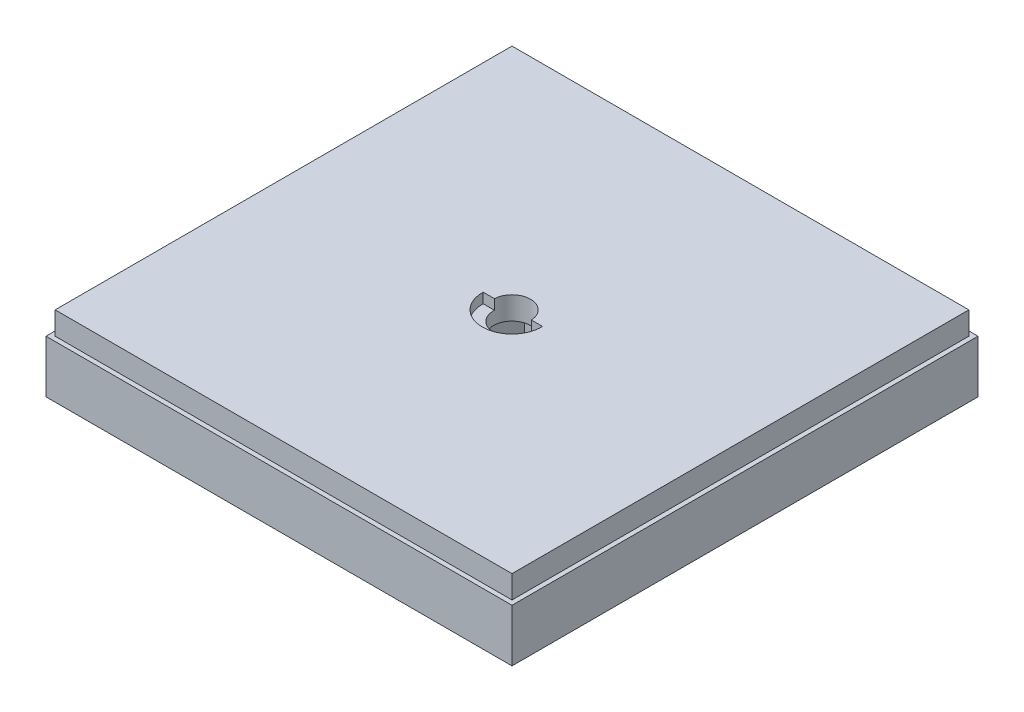
ISO-10303-21;
HEADER;
FILE_DESCRIPTION(('STEP AP214'),'2;1');
FILE_NAME('part.step','',(''),(''),'','','');
FILE_SCHEMA(('AUTOMOTIVE_DESIGN { 1 0 10303 214 1 1 1 1 }'));
ENDSEC;
DATA;
#1=APPLICATION_CONTEXT('core data for automotive mechanical design processes');
#2=APPLICATION_PROTOCOL_DEFINITION('international standard','automotive_design',2000,#1);
#3=PRODUCT_CONTEXT('',#1,'mechanical');
#4=PRODUCT('Part','Part','',(#3));
#5=PRODUCT_RELATED_PRODUCT_CATEGORY('part','',(#4));
#6=PRODUCT_DEFINITION_FORMATION('','',#4);
#7=PRODUCT_DEFINITION_CONTEXT('part definition',#1,'design');
#8=PRODUCT_DEFINITION('design','',#6,#7);
#9=PRODUCT_DEFINITION_SHAPE('','',#8);
#10=(LENGTH_UNIT() NAMED_UNIT(*) SI_UNIT(.MILLI.,.METRE.));
#11=(NAMED_UNIT(*) PLANE_ANGLE_UNIT() SI_UNIT($,.RADIAN.));
#12=(NAMED_UNIT(*) SI_UNIT($,.STERADIAN.) SOLID_ANGLE_UNIT());
#13=UNCERTAINTY_MEASURE_WITH_UNIT(LENGTH_MEASURE(1.E-05),#10,'distance_accuracy_value','');
#14=(GEOMETRIC_REPRESENTATION_CONTEXT(3) GLOBAL_UNCERTAINTY_ASSIGNED_CONTEXT((#13)) GLOBAL_UNIT_ASSIGNED_CONTEXT((#10,
#11,#12)) REPRESENTATION_CONTEXT('',''));
#15=CARTESIAN_POINT('',(0.,0.,0.));
#16=DIRECTION('',(0.,0.,1.));
#17=DIRECTION('',(1.,0.,0.));
#18=AXIS2_PLACEMENT_3D('',#15,#16,#17);
#19=CARTESIAN_POINT('',(-47.2472232502674,11.5,-44.5));
#20=DIRECTION('',(-0.866025403784439,0.,-0.5));
#21=DIRECTION('',(-0.5,0.,0.866025403784439));
#22=AXIS2_PLACEMENT_3D('',#19,#20,#21);
#23=PLANE('',#22);
#24=DIRECTION('',(0.,-1.,0.));
#25=VECTOR('',#24,1.);
#26=CARTESIAN_POINT('',(-43.4944465005349,11.5,-51.));
#27=LINE('',#26,#25);
#28=CARTESIAN_POINT('',(-43.4944465005349,11.5,-51.));
#29=VERTEX_POINT('',#28);
#30=CARTESIAN_POINT('',(-43.4944465005349,7.,-51.));
#31=VERTEX_POINT('',#30);
#32=EDGE_CURVE('E320',#29,#31,#27,.T.);
#33=ORIENTED_EDGE('',*,*,#32,.T.);
#34=DIRECTION('',(-0.5,0.,0.866025403784439));
#35=VECTOR('',#34,1.);
#36=CARTESIAN_POINT('',(-47.2472232502674,7.,-44.5));
#37=LINE('',#36,#35);
#38=CARTESIAN_POINT('',(-47.2472232502674,7.,-44.5));
#39=VERTEX_POINT('',#38);
#40=EDGE_CURVE('E219',#31,#39,#37,.T.);
#41=ORIENTED_EDGE('',*,*,#40,.T.);
#42=DIRECTION('',(0.,-1.,0.));
#43=VECTOR('',#42,1.);
#44=CARTESIAN_POINT('',(-47.2472232502674,11.5,-44.5));
#45=LINE('',#44,#43);
#46=CARTESIAN_POINT('',(-47.2472232502674,11.5,-44.5));
#47=VERTEX_POINT('',#46);
#48=EDGE_CURVE('E300',#47,#39,#45,.T.);
#49=ORIENTED_EDGE('',*,*,#48,.F.);
#50=DIRECTION('',(0.5,0.,-0.866025403784439));
#51=VECTOR('',#50,1.);
#52=CARTESIAN_POINT('',(-47.2472232502674,11.5,-44.5));
#53=LINE('',#52,#51);
#54=EDGE_CURVE('E276',#47,#29,#53,.T.);
#55=ORIENTED_EDGE('',*,*,#54,.T.);
#56=EDGE_LOOP('',(#33,#41,#49,#55));
#57=FACE_BOUND('',#56,.T.);
#58=ADVANCED_FACE('F39',(#57),#23,.T.);
#59=CARTESIAN_POINT('',(-43.4944465005349,11.5,-51.));
#60=DIRECTION('',(-0.866025403784439,0.,0.5));
#61=DIRECTION('',(0.5,0.,0.866025403784439));
#62=AXIS2_PLACEMENT_3D('',#59,#60,#61);
#63=PLANE('',#62);
#64=DIRECTION('',(0.,-1.,0.));
#65=VECTOR('',#64,1.);
#66=CARTESIAN_POINT('',(-47.2472232502674,11.5,-57.5));
#67=LINE('',#66,#65);
#68=CARTESIAN_POINT('',(-47.2472232502674,11.5,-57.5));
#69=VERTEX_POINT('',#68);
#70=CARTESIAN_POINT('',(-47.2472232502674,7.,-57.5));
#71=VERTEX_POINT('',#70);
#72=EDGE_CURVE('E316',#69,#71,#67,.T.);
#73=ORIENTED_EDGE('',*,*,#72,.T.);
#74=DIRECTION('',(0.5,0.,0.866025403784439));
#75=VECTOR('',#74,1.);
#76=CARTESIAN_POINT('',(-43.4944465005349,7.,-51.));
#77=LINE('',#76,#75);
#78=EDGE_CURVE('E215',#71,#31,#77,.T.);
#79=ORIENTED_EDGE('',*,*,#78,.T.);
#80=ORIENTED_EDGE('',*,*,#32,.F.);
#81=DIRECTION('',(-0.5,0.,-0.866025403784439));
#82=VECTOR('',#81,1.);
#83=CARTESIAN_POINT('',(-43.4944465005349,11.5,-51.));
#84=LINE('',#83,#82);
#85=EDGE_CURVE('E280',#29,#69,#84,.T.);
#86=ORIENTED_EDGE('',*,*,#85,.T.);
#87=EDGE_LOOP('',(#73,#79,#80,#86));
#88=FACE_BOUND('',#87,.T.);
#89=ADVANCED_FACE('F406',(#88),#63,.T.);
#90=CARTESIAN_POINT('',(-47.2472232502674,11.5,-57.5));
#91=DIRECTION('',(0.,0.,1.));
#92=DIRECTION('',(1.,0.,0.));
#93=AXIS2_PLACEMENT_3D('',#90,#91,#92);
#94=PLANE('',#93);
#95=DIRECTION('',(0.,-1.,0.));
#96=VECTOR('',#95,1.);
#97=CARTESIAN_POINT('',(-54.7527767497326,11.5,-57.5));
#98=LINE('',#97,#96);
#99=CARTESIAN_POINT('',(-54.7527767497326,11.5,-57.5));
#100=VERTEX_POINT('',#99);
#101=CARTESIAN_POINT('',(-54.7527767497326,7.,-57.5));
#102=VERTEX_POINT('',#101);
#103=EDGE_CURVE('E312',#100,#102,#98,.T.);
#104=ORIENTED_EDGE('',*,*,#103,.T.);
#105=DIRECTION('',(1.,0.,0.));
#106=VECTOR('',#105,1.);
#107=CARTESIAN_POINT('',(-47.2472232502674,7.,-57.5));
#108=LINE('',#107,#106);
#109=EDGE_CURVE('E211',#102,#71,#108,.T.);
#110=ORIENTED_EDGE('',*,*,#109,.T.);
#111=ORIENTED_EDGE('',*,*,#72,.F.);
#112=DIRECTION('',(-1.,0.,0.));
#113=VECTOR('',#112,1.);
#114=CARTESIAN_POINT('',(-47.2472232502674,11.5,-57.5));
#115=LINE('',#114,#113);
#116=EDGE_CURVE('E284',#69,#100,#115,.T.);
#117=ORIENTED_EDGE('',*,*,#116,.T.);
#118=EDGE_LOOP('',(#104,#110,#111,#117));
#119=FACE_BOUND('',#118,.T.);
#120=ADVANCED_FACE('F412',(#119),#94,.T.);
#121=CARTESIAN_POINT('',(-54.7527767497326,11.5,-57.5));
#122=DIRECTION('',(0.866025403784438,0.,0.5));
#123=DIRECTION('',(0.500000000000001,0.,-0.866025403784438));
#124=AXIS2_PLACEMENT_3D('',#121,#122,#123);
#125=PLANE('',#124);
#126=DIRECTION('',(0.,-1.,0.));
#127=VECTOR('',#126,1.);
#128=CARTESIAN_POINT('',(-58.5055534994651,11.5,-51.));
#129=LINE('',#128,#127);
#130=CARTESIAN_POINT('',(-58.5055534994651,11.5,-51.));
#131=VERTEX_POINT('',#130);
#132=CARTESIAN_POINT('',(-58.5055534994651,7.,-51.));
#133=VERTEX_POINT('',#132);
#134=EDGE_CURVE('E308',#131,#133,#129,.T.);
#135=ORIENTED_EDGE('',*,*,#134,.T.);
#136=DIRECTION('',(0.500000000000001,0.,-0.866025403784438));
#137=VECTOR('',#136,1.);
#138=CARTESIAN_POINT('',(-54.7527767497326,7.,-57.5));
#139=LINE('',#138,#137);
#140=EDGE_CURVE('E207',#133,#102,#139,.T.);
#141=ORIENTED_EDGE('',*,*,#140,.T.);
#142=ORIENTED_EDGE('',*,*,#103,.F.);
#143=DIRECTION('',(-0.5,0.,0.866025403784438));
#144=VECTOR('',#143,1.);
#145=CARTESIAN_POINT('',(-54.7527767497326,11.5,-57.5));
#146=LINE('',#145,#144);
#147=EDGE_CURVE('E288',#100,#131,#146,.T.);
#148=ORIENTED_EDGE('',*,*,#147,.T.);
#149=EDGE_LOOP('',(#135,#141,#142,#148));
#150=FACE_BOUND('',#149,.T.);
#151=ADVANCED_FACE('F477',(#150),#125,.T.);
#152=CARTESIAN_POINT('',(-58.5055534994651,11.5,-51.));
#153=DIRECTION('',(0.866025403784439,0.,-0.5));
#154=DIRECTION('',(-0.5,0.,-0.866025403784439));
#155=AXIS2_PLACEMENT_3D('',#152,#153,#154);
#156=PLANE('',#155);
#157=DIRECTION('',(0.,-1.,0.));
#158=VECTOR('',#157,1.);
#159=CARTESIAN_POINT('',(-54.7527767497326,11.5,-44.5));
#160=LINE('',#159,#158);
#161=CARTESIAN_POINT('',(-54.7527767497326,11.5,-44.5));
#162=VERTEX_POINT('',#161);
#163=CARTESIAN_POINT('',(-54.7527767497326,7.,-44.5));
#164=VERTEX_POINT('',#163);
#165=EDGE_CURVE('E304',#162,#164,#160,.T.);
#166=ORIENTED_EDGE('',*,*,#165,.T.);
#167=DIRECTION('',(-0.5,0.,-0.866025403784439));
#168=VECTOR('',#167,1.);
#169=CARTESIAN_POINT('',(-58.5055534994651,7.,-51.));
#170=LINE('',#169,#168);
#171=EDGE_CURVE('E62',#164,#133,#170,.T.);
#172=ORIENTED_EDGE('',*,*,#171,.T.);
#173=ORIENTED_EDGE('',*,*,#134,.F.);
#174=DIRECTION('',(0.5,0.,0.866025403784439));
#175=VECTOR('',#174,1.);
#176=CARTESIAN_POINT('',(-58.5055534994651,11.5,-51.));
#177=LINE('',#176,#175);
#178=EDGE_CURVE('E292',#131,#162,#177,.T.);
#179=ORIENTED_EDGE('',*,*,#178,.T.);
#180=EDGE_LOOP('',(#166,#172,#173,#179));
#181=FACE_BOUND('',#180,.T.);
#182=ADVANCED_FACE('F469',(#181),#156,.T.);
#183=CARTESIAN_POINT('',(-54.7527767497326,11.5,-44.5));
#184=DIRECTION('',(0.,0.,-1.));
#185=DIRECTION('',(-1.,0.,0.));
#186=AXIS2_PLACEMENT_3D('',#183,#184,#185);
#187=PLANE('',#186);
#188=ORIENTED_EDGE('',*,*,#48,.T.);
#189=DIRECTION('',(-1.,0.,0.));
#190=VECTOR('',#189,1.);
#191=CARTESIAN_POINT('',(-54.7527767497326,7.,-44.5));
#192=LINE('',#191,#190);
#193=EDGE_CURVE('E366',#39,#164,#192,.T.);
#194=ORIENTED_EDGE('',*,*,#193,.T.);
#195=ORIENTED_EDGE('',*,*,#165,.F.);
#196=DIRECTION('',(1.,0.,0.));
#197=VECTOR('',#196,1.);
#198=CARTESIAN_POINT('',(-54.7527767497326,11.5,-44.5));
#199=LINE('',#198,#197);
#200=EDGE_CURVE('E296',#162,#47,#199,.T.);
#201=ORIENTED_EDGE('',*,*,#200,.T.);
#202=EDGE_LOOP('',(#188,#194,#195,#201));
#203=FACE_BOUND('',#202,.T.);
#204=ADVANCED_FACE('F421',(#203),#187,.T.);
#205=CARTESIAN_POINT('',(0.,11.5,0.));
#206=DIRECTION('',(0.,1.,0.));
#207=DIRECTION('',(0.,0.,1.));
#208=AXIS2_PLACEMENT_3D('',#205,#206,#207);
#209=PLANE('',#208);
#210=DIRECTION('',(-1.,0.,0.));
#211=VECTOR('',#210,1.);
#212=CARTESIAN_POINT('',(-1.,11.5,-101.));
#213=LINE('',#212,#211);
#214=CARTESIAN_POINT('',(-1.,11.5,-101.));
#215=VERTEX_POINT('',#214);
#216=CARTESIAN_POINT('',(-101.,11.5,-101.));
#217=VERTEX_POINT('',#216);
#218=EDGE_CURVE('E228',#215,#217,#213,.T.);
#219=ORIENTED_EDGE('',*,*,#218,.F.);
#220=DIRECTION('',(0.,0.,-1.));
#221=VECTOR('',#220,1.);
#222=CARTESIAN_POINT('',(-1.,11.5,-1.));
#223=LINE('',#222,#221);
#224=CARTESIAN_POINT('',(-1.,11.5,-1.));
#225=VERTEX_POINT('',#224);
#226=EDGE_CURVE('E237',#225,#215,#223,.T.);
#227=ORIENTED_EDGE('',*,*,#226,.F.);
#228=DIRECTION('',(1.,0.,0.));
#229=VECTOR('',#228,1.);
#230=CARTESIAN_POINT('',(-101.,11.5,-1.));
#231=LINE('',#230,#229);
#232=CARTESIAN_POINT('',(-101.,11.5,-1.));
#233=VERTEX_POINT('',#232);
#234=EDGE_CURVE('E254',#233,#225,#231,.T.);
#235=ORIENTED_EDGE('',*,*,#234,.F.);
#236=DIRECTION('',(0.,0.,1.));
#237=VECTOR('',#236,1.);
#238=CARTESIAN_POINT('',(-101.,11.5,-101.));
#239=LINE('',#238,#237);
#240=EDGE_CURVE('E250',#217,#233,#239,.T.);
#241=ORIENTED_EDGE('',*,*,#240,.F.);
#242=EDGE_LOOP('',(#219,#227,#235,#241));
#243=FACE_BOUND('',#242,.T.);
#244=DIRECTION('',(0.,0.,1.));
#245=VECTOR('',#244,1.);
#246=CARTESIAN_POINT('',(-102.,11.5,-102.));
#247=LINE('',#246,#245);
#248=CARTESIAN_POINT('',(-102.,11.5,-102.));
#249=VERTEX_POINT('',#248);
#250=CARTESIAN_POINT('',(-102.,11.5,0.));
#251=VERTEX_POINT('',#250);
#252=EDGE_CURVE('E325',#249,#251,#247,.T.);
#253=ORIENTED_EDGE('',*,*,#252,.T.);
#254=DIRECTION('',(1.,0.,0.));
#255=VECTOR('',#254,1.);
#256=CARTESIAN_POINT('',(-102.,11.5,0.));
#257=LINE('',#256,#255);
#258=CARTESIAN_POINT('',(0.,11.5,0.));
#259=VERTEX_POINT('',#258);
#260=EDGE_CURVE('E329',#251,#259,#257,.T.);
#261=ORIENTED_EDGE('',*,*,#260,.T.);
#262=DIRECTION('',(0.,0.,-1.));
#263=VECTOR('',#262,1.);
#264=CARTESIAN_POINT('',(0.,11.5,-102.));
#265=LINE('',#264,#263);
#266=CARTESIAN_POINT('',(0.,11.5,-102.));
#267=VERTEX_POINT('',#266);
#268=EDGE_CURVE('E333',#259,#267,#265,.T.);
#269=ORIENTED_EDGE('',*,*,#268,.T.);
#270=DIRECTION('',(-1.,0.,0.));
#271=VECTOR('',#270,1.);
#272=CARTESIAN_POINT('',(-102.,11.5,-102.));
#273=LINE('',#272,#271);
#274=EDGE_CURVE('E336',#267,#249,#273,.T.);
#275=ORIENTED_EDGE('',*,*,#274,.T.);
#276=EDGE_LOOP('',(#253,#261,#269,#275));
#277=FACE_BOUND('',#276,.T.);
#278=ADVANCED_FACE('F417',(#243,#277),#209,.T.);
#279=CARTESIAN_POINT('',(0.,0.,0.));
#280=DIRECTION('',(0.,1.,0.));
#281=DIRECTION('',(0.,0.,1.));
#282=AXIS2_PLACEMENT_3D('',#279,#280,#281);
#283=PLANE('',#282);
#284=CARTESIAN_POINT('',(-51.,0.,-51.));
#285=DIRECTION('',(0.,-1.,0.));
#286=DIRECTION('',(0.,0.,-1.));
#287=AXIS2_PLACEMENT_3D('',#284,#285,#286);
#288=CIRCLE('',#287,8.);
#289=CARTESIAN_POINT('',(-51.,0.,-59.));
#290=VERTEX_POINT('',#289);
#291=EDGE_CURVE('E196',#290,#290,#288,.T.);
#292=ORIENTED_EDGE('',*,*,#291,.F.);
#293=EDGE_LOOP('',(#292));
#294=FACE_BOUND('',#293,.T.);
#295=DIRECTION('',(0.,0.,1.));
#296=VECTOR('',#295,1.);
#297=CARTESIAN_POINT('',(-102.,0.,-102.));
#298=LINE('',#297,#296);
#299=CARTESIAN_POINT('',(-102.,0.,-102.));
#300=VERTEX_POINT('',#299);
#301=CARTESIAN_POINT('',(-102.,0.,0.));
#302=VERTEX_POINT('',#301);
#303=EDGE_CURVE('E324',#300,#302,#298,.T.);
#304=ORIENTED_EDGE('',*,*,#303,.F.);
#305=DIRECTION('',(-1.,0.,0.));
#306=VECTOR('',#305,1.);
#307=CARTESIAN_POINT('',(-102.,0.,-102.));
#308=LINE('',#307,#306);
#309=CARTESIAN_POINT('',(0.,0.,-102.));
#310=VERTEX_POINT('',#309);
#311=EDGE_CURVE('E330',#310,#300,#308,.T.);
#312=ORIENTED_EDGE('',*,*,#311,.F.);
#313=DIRECTION('',(0.,0.,-1.));
#314=VECTOR('',#313,1.);
#315=CARTESIAN_POINT('',(0.,0.,-102.));
#316=LINE('',#315,#314);
#317=CARTESIAN_POINT('',(0.,0.,0.));
#318=VERTEX_POINT('',#317);
#319=EDGE_CURVE('E346',#318,#310,#316,.T.);
#320=ORIENTED_EDGE('',*,*,#319,.F.);
#321=DIRECTION('',(1.,0.,0.));
#322=VECTOR('',#321,1.);
#323=CARTESIAN_POINT('',(-102.,0.,0.));
#324=LINE('',#323,#322);
#325=EDGE_CURVE('E343',#302,#318,#324,.T.);
#326=ORIENTED_EDGE('',*,*,#325,.F.);
#327=EDGE_LOOP('',(#304,#312,#320,#326));
#328=FACE_BOUND('',#327,.T.);
#329=ADVANCED_FACE('F420',(#294,#328),#283,.F.);
#330=CARTESIAN_POINT('',(-102.,11.5,-102.));
#331=DIRECTION('',(1.,0.,0.));
#332=DIRECTION('',(0.,0.,-1.));
#333=AXIS2_PLACEMENT_3D('',#330,#331,#332);
#334=PLANE('',#333);
#335=ORIENTED_EDGE('',*,*,#303,.T.);
#336=DIRECTION('',(0.,-1.,0.));
#337=VECTOR('',#336,1.);
#338=CARTESIAN_POINT('',(-102.,11.5,0.));
#339=LINE('',#338,#337);
#340=EDGE_CURVE('E362',#251,#302,#339,.T.);
#341=ORIENTED_EDGE('',*,*,#340,.F.);
#342=ORIENTED_EDGE('',*,*,#252,.F.);
#343=DIRECTION('',(0.,-1.,0.));
#344=VECTOR('',#343,1.);
#345=CARTESIAN_POINT('',(-102.,11.5,-102.));
#346=LINE('',#345,#344);
#347=EDGE_CURVE('E339',#249,#300,#346,.T.);
#348=ORIENTED_EDGE('',*,*,#347,.T.);
#349=EDGE_LOOP('',(#335,#341,#342,#348));
#350=FACE_BOUND('',#349,.T.);
#351=ADVANCED_FACE('F41',(#350),#334,.F.);
#352=CARTESIAN_POINT('',(-102.,11.5,0.));
#353=DIRECTION('',(0.,0.,-1.));
#354=DIRECTION('',(-1.,0.,0.));
#355=AXIS2_PLACEMENT_3D('',#352,#353,#354);
#356=PLANE('',#355);
#357=ORIENTED_EDGE('',*,*,#325,.T.);
#358=DIRECTION('',(0.,-1.,0.));
#359=VECTOR('',#358,1.);
#360=CARTESIAN_POINT('',(0.,11.5,0.));
#361=LINE('',#360,#359);
#362=EDGE_CURVE('E358',#259,#318,#361,.T.);
#363=ORIENTED_EDGE('',*,*,#362,.F.);
#364=ORIENTED_EDGE('',*,*,#260,.F.);
#365=ORIENTED_EDGE('',*,*,#340,.T.);
#366=EDGE_LOOP('',(#357,#363,#364,#365));
#367=FACE_BOUND('',#366,.T.);
#368=ADVANCED_FACE('F431',(#367),#356,.F.);
#369=CARTESIAN_POINT('',(0.,11.5,-102.));
#370=DIRECTION('',(-1.,0.,0.));
#371=DIRECTION('',(0.,0.,1.));
#372=AXIS2_PLACEMENT_3D('',#369,#370,#371);
#373=PLANE('',#372);
#374=ORIENTED_EDGE('',*,*,#319,.T.);
#375=DIRECTION('',(0.,-1.,0.));
#376=VECTOR('',#375,1.);
#377=CARTESIAN_POINT('',(0.,11.5,-102.));
#378=LINE('',#377,#376);
#379=EDGE_CURVE('E354',#267,#310,#378,.T.);
#380=ORIENTED_EDGE('',*,*,#379,.F.);
#381=ORIENTED_EDGE('',*,*,#268,.F.);
#382=ORIENTED_EDGE('',*,*,#362,.T.);
#383=EDGE_LOOP('',(#374,#380,#381,#382));
#384=FACE_BOUND('',#383,.T.);
#385=ADVANCED_FACE('F428',(#384),#373,.F.);
#386=CARTESIAN_POINT('',(-102.,11.5,-102.));
#387=DIRECTION('',(0.,0.,1.));
#388=DIRECTION('',(1.,0.,0.));
#389=AXIS2_PLACEMENT_3D('',#386,#387,#388);
#390=PLANE('',#389);
#391=ORIENTED_EDGE('',*,*,#311,.T.);
#392=ORIENTED_EDGE('',*,*,#347,.F.);
#393=ORIENTED_EDGE('',*,*,#274,.F.);
#394=ORIENTED_EDGE('',*,*,#379,.T.);
#395=EDGE_LOOP('',(#391,#392,#393,#394));
#396=FACE_BOUND('',#395,.T.);
#397=ADVANCED_FACE('F402',(#396),#390,.F.);
#398=CARTESIAN_POINT('',(0.,16.5,0.));
#399=DIRECTION('',(0.,1.,0.));
#400=DIRECTION('',(0.,0.,1.));
#401=AXIS2_PLACEMENT_3D('',#398,#399,#400);
#402=PLANE('',#401);
#403=DIRECTION('',(-1.,0.,0.));
#404=VECTOR('',#403,1.);
#405=CARTESIAN_POINT('',(-57.4969223483123,16.5,-51.2));
#406=LINE('',#405,#404);
#407=CARTESIAN_POINT('',(-44.5030776516877,16.5,-51.2));
#408=VERTEX_POINT('',#407);
#409=CARTESIAN_POINT('',(-46.9549412859638,16.5,-51.2));
#410=VERTEX_POINT('',#409);
#411=EDGE_CURVE('E181',#408,#410,#406,.T.);
#412=ORIENTED_EDGE('',*,*,#411,.F.);
#413=CARTESIAN_POINT('',(-51.,16.5,-51.));
#414=DIRECTION('',(0.,1.,0.));
#415=DIRECTION('',(0.,0.,1.));
#416=AXIS2_PLACEMENT_3D('',#413,#414,#415);
#417=CIRCLE('',#416,6.5);
#418=CARTESIAN_POINT('',(-57.4969223483123,16.5,-51.2));
#419=VERTEX_POINT('',#418);
#420=EDGE_CURVE('E170',#419,#408,#417,.T.);
#421=ORIENTED_EDGE('',*,*,#420,.F.);
#422=CARTESIAN_POINT('',(-55.0450587140362,16.5,-51.2));
#423=VERTEX_POINT('',#422);
#424=EDGE_CURVE('E192',#423,#419,#406,.T.);
#425=ORIENTED_EDGE('',*,*,#424,.F.);
#426=CARTESIAN_POINT('',(-51.,16.5,-51.));
#427=DIRECTION('',(0.,1.,0.));
#428=DIRECTION('',(0.,0.,1.));
#429=AXIS2_PLACEMENT_3D('',#426,#427,#428);
#430=CIRCLE('',#429,4.05);
#431=EDGE_CURVE('E224',#410,#423,#430,.T.);
#432=ORIENTED_EDGE('',*,*,#431,.F.);
#433=EDGE_LOOP('',(#412,#421,#425,#432));
#434=FACE_BOUND('',#433,.T.);
#435=DIRECTION('',(-1.,0.,0.));
#436=VECTOR('',#435,1.);
#437=CARTESIAN_POINT('',(-1.,16.5,-101.));
#438=LINE('',#437,#436);
#439=CARTESIAN_POINT('',(-1.,16.5,-101.));
#440=VERTEX_POINT('',#439);
#441=CARTESIAN_POINT('',(-101.,16.5,-101.));
#442=VERTEX_POINT('',#441);
#443=EDGE_CURVE('E232',#440,#442,#438,.T.);
#444=ORIENTED_EDGE('',*,*,#443,.T.);
#445=DIRECTION('',(0.,0.,1.));
#446=VECTOR('',#445,1.);
#447=CARTESIAN_POINT('',(-101.,16.5,-101.));
#448=LINE('',#447,#446);
#449=CARTESIAN_POINT('',(-101.,16.5,-1.));
#450=VERTEX_POINT('',#449);
#451=EDGE_CURVE('E236',#442,#450,#448,.T.);
#452=ORIENTED_EDGE('',*,*,#451,.T.);
#453=DIRECTION('',(1.,0.,0.));
#454=VECTOR('',#453,1.);
#455=CARTESIAN_POINT('',(-101.,16.5,-1.));
#456=LINE('',#455,#454);
#457=CARTESIAN_POINT('',(-1.,16.5,-1.));
#458=VERTEX_POINT('',#457);
#459=EDGE_CURVE('E240',#450,#458,#456,.T.);
#460=ORIENTED_EDGE('',*,*,#459,.T.);
#461=DIRECTION('',(0.,0.,-1.));
#462=VECTOR('',#461,1.);
#463=CARTESIAN_POINT('',(-1.,16.5,-1.));
#464=LINE('',#463,#462);
#465=EDGE_CURVE('E243',#458,#440,#464,.T.);
#466=ORIENTED_EDGE('',*,*,#465,.T.);
#467=EDGE_LOOP('',(#444,#452,#460,#466));
#468=FACE_BOUND('',#467,.T.);
#469=ADVANCED_FACE('F379',(#434,#468),#402,.T.);
#470=CARTESIAN_POINT('',(0.,11.5,0.));
#471=DIRECTION('',(0.,1.,0.));
#472=DIRECTION('',(0.,0.,1.));
#473=AXIS2_PLACEMENT_3D('',#470,#471,#472);
#474=PLANE('',#473);
#475=ORIENTED_EDGE('',*,*,#85,.F.);
#476=ORIENTED_EDGE('',*,*,#54,.F.);
#477=ORIENTED_EDGE('',*,*,#200,.F.);
#478=ORIENTED_EDGE('',*,*,#178,.F.);
#479=ORIENTED_EDGE('',*,*,#147,.F.);
#480=ORIENTED_EDGE('',*,*,#116,.F.);
#481=EDGE_LOOP('',(#475,#476,#477,#478,#479,#480));
#482=FACE_BOUND('',#481,.T.);
#483=CARTESIAN_POINT('',(-51.,11.5,-51.));
#484=DIRECTION('',(0.,1.,0.));
#485=DIRECTION('',(0.,0.,1.));
#486=AXIS2_PLACEMENT_3D('',#483,#484,#485);
#487=CIRCLE('',#486,4.05);
#488=CARTESIAN_POINT('',(-51.,11.5,-46.95));
#489=VERTEX_POINT('',#488);
#490=EDGE_CURVE('E223',#489,#489,#487,.T.);
#491=ORIENTED_EDGE('',*,*,#490,.T.);
#492=EDGE_LOOP('',(#491));
#493=FACE_BOUND('',#492,.T.);
#494=ADVANCED_FACE('F390',(#482,#493),#474,.F.);
#495=CARTESIAN_POINT('',(-1.,16.5,-101.));
#496=DIRECTION('',(0.,0.,1.));
#497=DIRECTION('',(1.,0.,0.));
#498=AXIS2_PLACEMENT_3D('',#495,#496,#497);
#499=PLANE('',#498);
#500=ORIENTED_EDGE('',*,*,#218,.T.);
#501=DIRECTION('',(0.,-1.,0.));
#502=VECTOR('',#501,1.);
#503=CARTESIAN_POINT('',(-101.,16.5,-101.));
#504=LINE('',#503,#502);
#505=EDGE_CURVE('E272',#442,#217,#504,.T.);
#506=ORIENTED_EDGE('',*,*,#505,.F.);
#507=ORIENTED_EDGE('',*,*,#443,.F.);
#508=DIRECTION('',(0.,-1.,0.));
#509=VECTOR('',#508,1.);
#510=CARTESIAN_POINT('',(-1.,16.5,-101.));
#511=LINE('',#510,#509);
#512=EDGE_CURVE('E246',#440,#215,#511,.T.);
#513=ORIENTED_EDGE('',*,*,#512,.T.);
#514=EDGE_LOOP('',(#500,#506,#507,#513));
#515=FACE_BOUND('',#514,.T.);
#516=ADVANCED_FACE('F392',(#515),#499,.F.);
#517=CARTESIAN_POINT('',(-101.,16.5,-101.));
#518=DIRECTION('',(1.,0.,0.));
#519=DIRECTION('',(0.,0.,-1.));
#520=AXIS2_PLACEMENT_3D('',#517,#518,#519);
#521=PLANE('',#520);
#522=ORIENTED_EDGE('',*,*,#240,.T.);
#523=DIRECTION('',(0.,-1.,0.));
#524=VECTOR('',#523,1.);
#525=CARTESIAN_POINT('',(-101.,16.5,-1.));
#526=LINE('',#525,#524);
#527=EDGE_CURVE('E268',#450,#233,#526,.T.);
#528=ORIENTED_EDGE('',*,*,#527,.F.);
#529=ORIENTED_EDGE('',*,*,#451,.F.);
#530=ORIENTED_EDGE('',*,*,#505,.T.);
#531=EDGE_LOOP('',(#522,#528,#529,#530));
#532=FACE_BOUND('',#531,.T.);
#533=ADVANCED_FACE('F399',(#532),#521,.F.);
#534=CARTESIAN_POINT('',(-101.,16.5,-1.));
#535=DIRECTION('',(0.,0.,-1.));
#536=DIRECTION('',(-1.,0.,0.));
#537=AXIS2_PLACEMENT_3D('',#534,#535,#536);
#538=PLANE('',#537);
#539=ORIENTED_EDGE('',*,*,#234,.T.);
#540=DIRECTION('',(0.,-1.,0.));
#541=VECTOR('',#540,1.);
#542=CARTESIAN_POINT('',(-1.,16.5,-1.));
#543=LINE('',#542,#541);
#544=EDGE_CURVE('E264',#458,#225,#543,.T.);
#545=ORIENTED_EDGE('',*,*,#544,.F.);
#546=ORIENTED_EDGE('',*,*,#459,.F.);
#547=ORIENTED_EDGE('',*,*,#527,.T.);
#548=EDGE_LOOP('',(#539,#545,#546,#547));
#549=FACE_BOUND('',#548,.T.);
#550=ADVANCED_FACE('F510',(#549),#538,.F.);
#551=CARTESIAN_POINT('',(-1.,16.5,-1.));
#552=DIRECTION('',(-1.,0.,0.));
#553=DIRECTION('',(0.,0.,1.));
#554=AXIS2_PLACEMENT_3D('',#551,#552,#553);
#555=PLANE('',#554);
#556=ORIENTED_EDGE('',*,*,#226,.T.);
#557=ORIENTED_EDGE('',*,*,#512,.F.);
#558=ORIENTED_EDGE('',*,*,#465,.F.);
#559=ORIENTED_EDGE('',*,*,#544,.T.);
#560=EDGE_LOOP('',(#556,#557,#558,#559));
#561=FACE_BOUND('',#560,.T.);
#562=ADVANCED_FACE('F386',(#561),#555,.F.);
#563=CARTESIAN_POINT('',(-51.,16.5,-51.));
#564=DIRECTION('',(0.,-1.,0.));
#565=DIRECTION('',(0.,0.,-1.));
#566=AXIS2_PLACEMENT_3D('',#563,#564,#565);
#567=CYLINDRICAL_SURFACE('',#566,4.05);
#568=DIRECTION('',(0.,-1.,0.));
#569=VECTOR('',#568,1.);
#570=CARTESIAN_POINT('',(-46.9549412859638,16.5,-51.2));
#571=LINE('',#570,#569);
#572=CARTESIAN_POINT('',(-46.9549412859638,14.3,-51.2));
#573=VERTEX_POINT('',#572);
#574=EDGE_CURVE('E11',#410,#573,#571,.T.);
#575=ORIENTED_EDGE('',*,*,#574,.F.);
#576=ORIENTED_EDGE('',*,*,#431,.T.);
#577=DIRECTION('',(0.,-1.,0.));
#578=VECTOR('',#577,1.);
#579=CARTESIAN_POINT('',(-55.0450587140362,16.5,-51.2));
#580=LINE('',#579,#578);
#581=CARTESIAN_POINT('',(-55.0450587140362,14.3,-51.2));
#582=VERTEX_POINT('',#581);
#583=EDGE_CURVE('E48',#582,#423,#580,.F.);
#584=ORIENTED_EDGE('',*,*,#583,.F.);
#585=CARTESIAN_POINT('',(-51.,14.3,-51.));
#586=DIRECTION('',(0.,1.,0.));
#587=DIRECTION('',(0.,0.,1.));
#588=AXIS2_PLACEMENT_3D('',#585,#586,#587);
#589=CIRCLE('',#588,4.05);
#590=EDGE_CURVE('E369',#582,#573,#589,.T.);
#591=ORIENTED_EDGE('',*,*,#590,.T.);
#592=EDGE_LOOP('',(#575,#576,#584,#591));
#593=FACE_BOUND('',#592,.T.);
#594=ORIENTED_EDGE('',*,*,#490,.F.);
#595=EDGE_LOOP('',(#594));
#596=FACE_BOUND('',#595,.T.);
#597=ADVANCED_FACE('F382',(#593,#596),#567,.F.);
#598=CARTESIAN_POINT('',(-51.,7.,-51.));
#599=DIRECTION('',(0.,-1.,0.));
#600=DIRECTION('',(0.,0.,-1.));
#601=AXIS2_PLACEMENT_3D('',#598,#599,#600);
#602=CYLINDRICAL_SURFACE('',#601,8.);
#603=CARTESIAN_POINT('',(-51.,7.,-51.));
#604=DIRECTION('',(0.,-1.,0.));
#605=DIRECTION('',(0.,0.,-1.));
#606=AXIS2_PLACEMENT_3D('',#603,#604,#605);
#607=CIRCLE('',#606,8.);
#608=CARTESIAN_POINT('',(-51.,7.,-59.));
#609=VERTEX_POINT('',#608);
#610=EDGE_CURVE('E198',#609,#609,#607,.T.);
#611=ORIENTED_EDGE('',*,*,#610,.F.);
#612=EDGE_LOOP('',(#611));
#613=FACE_BOUND('',#612,.T.);
#614=ORIENTED_EDGE('',*,*,#291,.T.);
#615=EDGE_LOOP('',(#614));
#616=FACE_BOUND('',#615,.T.);
#617=ADVANCED_FACE('F385',(#613,#616),#602,.F.);
#618=CARTESIAN_POINT('',(-51.,7.,-51.));
#619=DIRECTION('',(0.,-1.,0.));
#620=DIRECTION('',(0.,0.,-1.));
#621=AXIS2_PLACEMENT_3D('',#618,#619,#620);
#622=PLANE('',#621);
#623=ORIENTED_EDGE('',*,*,#78,.F.);
#624=ORIENTED_EDGE('',*,*,#109,.F.);
#625=ORIENTED_EDGE('',*,*,#140,.F.);
#626=ORIENTED_EDGE('',*,*,#171,.F.);
#627=ORIENTED_EDGE('',*,*,#193,.F.);
#628=ORIENTED_EDGE('',*,*,#40,.F.);
#629=EDGE_LOOP('',(#623,#624,#625,#626,#627,#628));
#630=FACE_BOUND('',#629,.T.);
#631=ORIENTED_EDGE('',*,*,#610,.T.);
#632=EDGE_LOOP('',(#631));
#633=FACE_BOUND('',#632,.T.);
#634=ADVANCED_FACE('F572',(#630,#633),#622,.T.);
#635=CARTESIAN_POINT('',(-57.4969223483123,14.3,-51.2));
#636=DIRECTION('',(0.,0.,-1.));
#637=DIRECTION('',(-1.,0.,0.));
#638=AXIS2_PLACEMENT_3D('',#635,#636,#637);
#639=PLANE('',#638);
#640=ORIENTED_EDGE('',*,*,#574,.T.);
#641=DIRECTION('',(-1.,0.,0.));
#642=VECTOR('',#641,1.);
#643=CARTESIAN_POINT('',(-57.4969223483123,14.3,-51.2));
#644=LINE('',#643,#642);
#645=CARTESIAN_POINT('',(-44.5030776516877,14.3,-51.2));
#646=VERTEX_POINT('',#645);
#647=EDGE_CURVE('E55',#646,#573,#644,.T.);
#648=ORIENTED_EDGE('',*,*,#647,.F.);
#649=DIRECTION('',(0.,1.,0.));
#650=VECTOR('',#649,1.);
#651=CARTESIAN_POINT('',(-44.5030776516877,14.3,-51.2));
#652=LINE('',#651,#650);
#653=EDGE_CURVE('E165',#646,#408,#652,.T.);
#654=ORIENTED_EDGE('',*,*,#653,.T.);
#655=ORIENTED_EDGE('',*,*,#411,.T.);
#656=EDGE_LOOP('',(#640,#648,#654,#655));
#657=FACE_BOUND('',#656,.T.);
#658=ADVANCED_FACE('F183',(#657),#639,.F.);
#659=CARTESIAN_POINT('',(-51.,14.3,-51.));
#660=DIRECTION('',(0.,1.,0.));
#661=DIRECTION('',(0.,0.,1.));
#662=AXIS2_PLACEMENT_3D('',#659,#660,#661);
#663=CYLINDRICAL_SURFACE('',#662,6.5);
#664=ORIENTED_EDGE('',*,*,#420,.T.);
#665=ORIENTED_EDGE('',*,*,#653,.F.);
#666=CARTESIAN_POINT('',(-51.,14.3,-51.));
#667=DIRECTION('',(0.,1.,0.));
#668=DIRECTION('',(0.,0.,1.));
#669=AXIS2_PLACEMENT_3D('',#666,#667,#668);
#670=CIRCLE('',#669,6.5);
#671=CARTESIAN_POINT('',(-57.4969223483123,14.3,-51.2));
#672=VERTEX_POINT('',#671);
#673=EDGE_CURVE('E168',#672,#646,#670,.T.);
#674=ORIENTED_EDGE('',*,*,#673,.F.);
#675=DIRECTION('',(0.,1.,0.));
#676=VECTOR('',#675,1.);
#677=CARTESIAN_POINT('',(-57.4969223483123,14.3,-51.2));
#678=LINE('',#677,#676);
#679=EDGE_CURVE('E174',#672,#419,#678,.T.);
#680=ORIENTED_EDGE('',*,*,#679,.T.);
#681=EDGE_LOOP('',(#664,#665,#674,#680));
#682=FACE_BOUND('',#681,.T.);
#683=ADVANCED_FACE('F166',(#682),#663,.F.);
#684=ORIENTED_EDGE('',*,*,#583,.T.);
#685=ORIENTED_EDGE('',*,*,#424,.T.);
#686=ORIENTED_EDGE('',*,*,#679,.F.);
#687=EDGE_CURVE('E178',#582,#672,#644,.T.);
#688=ORIENTED_EDGE('',*,*,#687,.F.);
#689=EDGE_LOOP('',(#684,#685,#686,#688));
#690=FACE_BOUND('',#689,.T.);
#691=ADVANCED_FACE('F375',(#690),#639,.F.);
#692=CARTESIAN_POINT('',(-51.,14.3,-51.));
#693=DIRECTION('',(0.,1.,0.));
#694=DIRECTION('',(0.,0.,1.));
#695=AXIS2_PLACEMENT_3D('',#692,#693,#694);
#696=PLANE('',#695);
#697=ORIENTED_EDGE('',*,*,#687,.T.);
#698=ORIENTED_EDGE('',*,*,#673,.T.);
#699=ORIENTED_EDGE('',*,*,#647,.T.);
#700=ORIENTED_EDGE('',*,*,#590,.F.);
#701=EDGE_LOOP('',(#697,#698,#699,#700));
#702=FACE_BOUND('',#701,.T.);
#703=ADVANCED_FACE('F176',(#702),#696,.T.);
#704=CLOSED_SHELL('',(#58,#89,#120,#151,#182,#204,#278,#329,#351,#368,#385,#397,#469,#494,#516,
#533,#550,#562,#597,#617,#634,#658,#683,#691,#703));
#705=MANIFOLD_SOLID_BREP('B2',#704);
#706=ADVANCED_BREP_SHAPE_REPRESENTATION('',(#18,#705),#14);
#707=SHAPE_DEFINITION_REPRESENTATION(#9,#706);
ENDSEC;
END-ISO-10303-21;
